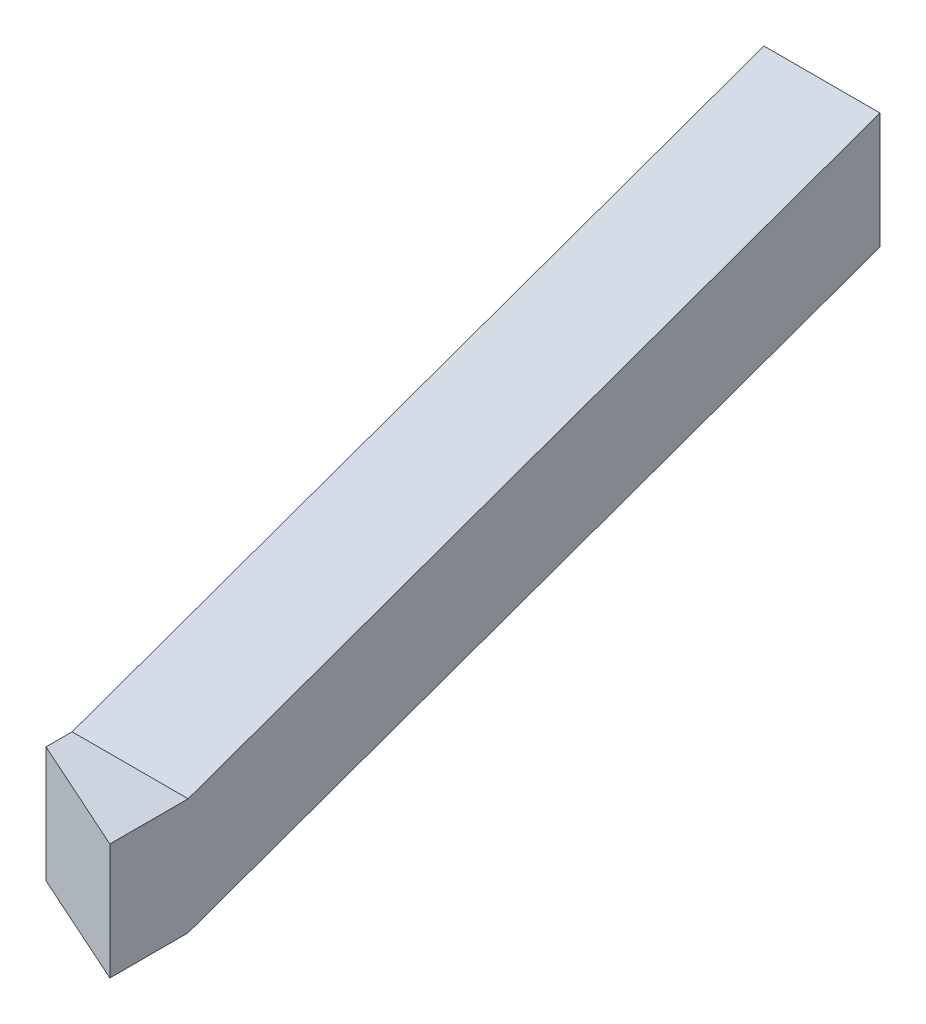
ISO-10303-21;
HEADER;
FILE_DESCRIPTION(('STEP AP214'),'2;1');
FILE_NAME('part.step','',(''),(''),'','','');
FILE_SCHEMA(('AUTOMOTIVE_DESIGN { 1 0 10303 214 1 1 1 1 }'));
ENDSEC;
DATA;
#1=APPLICATION_CONTEXT('core data for automotive mechanical design processes');
#2=APPLICATION_PROTOCOL_DEFINITION('international standard','automotive_design',2000,#1);
#3=PRODUCT_CONTEXT('',#1,'mechanical');
#4=PRODUCT('Part','Part','',(#3));
#5=PRODUCT_RELATED_PRODUCT_CATEGORY('part','',(#4));
#6=PRODUCT_DEFINITION_FORMATION('','',#4);
#7=PRODUCT_DEFINITION_CONTEXT('part definition',#1,'design');
#8=PRODUCT_DEFINITION('design','',#6,#7);
#9=PRODUCT_DEFINITION_SHAPE('','',#8);
#10=(LENGTH_UNIT() NAMED_UNIT(*) SI_UNIT(.MILLI.,.METRE.));
#11=(NAMED_UNIT(*) PLANE_ANGLE_UNIT() SI_UNIT($,.RADIAN.));
#12=(NAMED_UNIT(*) SI_UNIT($,.STERADIAN.) SOLID_ANGLE_UNIT());
#13=UNCERTAINTY_MEASURE_WITH_UNIT(LENGTH_MEASURE(1.E-05),#10,'distance_accuracy_value','');
#14=(GEOMETRIC_REPRESENTATION_CONTEXT(3) GLOBAL_UNCERTAINTY_ASSIGNED_CONTEXT((#13)) GLOBAL_UNIT_ASSIGNED_CONTEXT((#10,
#11,#12)) REPRESENTATION_CONTEXT('',''));
#15=CARTESIAN_POINT('',(0.,0.,0.));
#16=DIRECTION('',(0.,0.,1.));
#17=DIRECTION('',(1.,0.,0.));
#18=AXIS2_PLACEMENT_3D('',#15,#16,#17);
#19=CARTESIAN_POINT('',(0.,0.,-60.));
#20=DIRECTION('',(-1.,0.,0.));
#21=DIRECTION('',(0.,0.,1.));
#22=AXIS2_PLACEMENT_3D('',#19,#20,#21);
#23=PLANE('',#22);
#24=DIRECTION('',(0.,1.,0.));
#25=VECTOR('',#24,1.);
#26=CARTESIAN_POINT('',(0.,-11.1,-40.));
#27=LINE('',#26,#25);
#28=CARTESIAN_POINT('',(0.,0.,-40.));
#29=VERTEX_POINT('',#28);
#30=CARTESIAN_POINT('',(0.,88.9,-40.));
#31=VERTEX_POINT('',#30);
#32=EDGE_CURVE('E102',#29,#31,#27,.T.);
#33=ORIENTED_EDGE('',*,*,#32,.T.);
#34=DIRECTION('',(0.,0.,1.));
#35=VECTOR('',#34,1.);
#36=CARTESIAN_POINT('',(0.,88.9,-60.));
#37=LINE('',#36,#35);
#38=CARTESIAN_POINT('',(0.,88.9,-60.));
#39=VERTEX_POINT('',#38);
#40=EDGE_CURVE('E11',#39,#31,#37,.T.);
#41=ORIENTED_EDGE('',*,*,#40,.F.);
#42=DIRECTION('',(0.,-0.337461295829559,0.941339404156139));
#43=VECTOR('',#42,1.);
#44=CARTESIAN_POINT('',(0.,278.9,-590.));
#45=LINE('',#44,#43);
#46=CARTESIAN_POINT('',(0.,278.9,-590.));
#47=VERTEX_POINT('',#46);
#48=EDGE_CURVE('E95',#47,#39,#45,.T.);
#49=ORIENTED_EDGE('',*,*,#48,.F.);
#50=DIRECTION('',(0.,1.,0.));
#51=VECTOR('',#50,1.);
#52=CARTESIAN_POINT('',(0.,278.9,-590.));
#53=LINE('',#52,#51);
#54=CARTESIAN_POINT('',(0.,190.,-590.));
#55=VERTEX_POINT('',#54);
#56=EDGE_CURVE('E118',#55,#47,#53,.T.);
#57=ORIENTED_EDGE('',*,*,#56,.F.);
#58=DIRECTION('',(0.,-0.337461295829559,0.941339404156139));
#59=VECTOR('',#58,1.);
#60=CARTESIAN_POINT('',(0.,190.,-590.));
#61=LINE('',#60,#59);
#62=CARTESIAN_POINT('',(0.,0.,-60.));
#63=VERTEX_POINT('',#62);
#64=EDGE_CURVE('E120',#55,#63,#61,.T.);
#65=ORIENTED_EDGE('',*,*,#64,.T.);
#66=DIRECTION('',(0.,0.,1.));
#67=VECTOR('',#66,1.);
#68=CARTESIAN_POINT('',(0.,0.,-60.));
#69=LINE('',#68,#67);
#70=EDGE_CURVE('E38',#63,#29,#69,.T.);
#71=ORIENTED_EDGE('',*,*,#70,.T.);
#72=EDGE_LOOP('',(#33,#41,#49,#57,#65,#71));
#73=FACE_BOUND('',#72,.T.);
#74=ADVANCED_FACE('F35',(#73),#23,.T.);
#75=CARTESIAN_POINT('',(0.,88.9,-60.));
#76=DIRECTION('',(0.,1.,0.));
#77=DIRECTION('',(0.,0.,1.));
#78=AXIS2_PLACEMENT_3D('',#75,#76,#77);
#79=PLANE('',#78);
#80=DIRECTION('',(-0.911940698035273,0.,-0.41032202386289));
#81=VECTOR('',#80,1.);
#82=CARTESIAN_POINT('',(88.9,88.9,0.));
#83=LINE('',#82,#81);
#84=CARTESIAN_POINT('',(88.9,88.9,0.));
#85=VERTEX_POINT('',#84);
#86=EDGE_CURVE('E87',#85,#31,#83,.T.);
#87=ORIENTED_EDGE('',*,*,#86,.F.);
#88=DIRECTION('',(0.,0.,1.));
#89=VECTOR('',#88,1.);
#90=CARTESIAN_POINT('',(88.9,88.9,-60.));
#91=LINE('',#90,#89);
#92=CARTESIAN_POINT('',(88.9,88.9,-60.));
#93=VERTEX_POINT('',#92);
#94=EDGE_CURVE('E44',#93,#85,#91,.T.);
#95=ORIENTED_EDGE('',*,*,#94,.F.);
#96=DIRECTION('',(-1.,0.,0.));
#97=VECTOR('',#96,1.);
#98=CARTESIAN_POINT('',(0.,88.9,-60.));
#99=LINE('',#98,#97);
#100=EDGE_CURVE('E111',#93,#39,#99,.T.);
#101=ORIENTED_EDGE('',*,*,#100,.T.);
#102=ORIENTED_EDGE('',*,*,#40,.T.);
#103=EDGE_LOOP('',(#87,#95,#101,#102));
#104=FACE_BOUND('',#103,.T.);
#105=ADVANCED_FACE('F99',(#104),#79,.T.);
#106=CARTESIAN_POINT('',(88.9,0.,-60.));
#107=DIRECTION('',(1.,0.,0.));
#108=DIRECTION('',(0.,0.,-1.));
#109=AXIS2_PLACEMENT_3D('',#106,#107,#108);
#110=PLANE('',#109);
#111=DIRECTION('',(0.,1.,0.));
#112=VECTOR('',#111,1.);
#113=CARTESIAN_POINT('',(88.9,0.,0.));
#114=LINE('',#113,#112);
#115=CARTESIAN_POINT('',(88.9,0.,0.));
#116=VERTEX_POINT('',#115);
#117=EDGE_CURVE('E84',#116,#85,#114,.T.);
#118=ORIENTED_EDGE('',*,*,#117,.F.);
#119=DIRECTION('',(0.,0.,1.));
#120=VECTOR('',#119,1.);
#121=CARTESIAN_POINT('',(88.9,0.,-60.));
#122=LINE('',#121,#120);
#123=CARTESIAN_POINT('',(88.9,0.,-60.));
#124=VERTEX_POINT('',#123);
#125=EDGE_CURVE('E108',#124,#116,#122,.T.);
#126=ORIENTED_EDGE('',*,*,#125,.F.);
#127=DIRECTION('',(0.,-0.337461295829559,0.941339404156139));
#128=VECTOR('',#127,1.);
#129=CARTESIAN_POINT('',(88.9,190.,-590.));
#130=LINE('',#129,#128);
#131=CARTESIAN_POINT('',(88.9,190.,-590.));
#132=VERTEX_POINT('',#131);
#133=EDGE_CURVE('E51',#132,#124,#130,.T.);
#134=ORIENTED_EDGE('',*,*,#133,.F.);
#135=DIRECTION('',(0.,-1.,0.));
#136=VECTOR('',#135,1.);
#137=CARTESIAN_POINT('',(88.9,278.9,-590.));
#138=LINE('',#137,#136);
#139=CARTESIAN_POINT('',(88.9,278.9,-590.));
#140=VERTEX_POINT('',#139);
#141=EDGE_CURVE('E128',#140,#132,#138,.T.);
#142=ORIENTED_EDGE('',*,*,#141,.F.);
#143=DIRECTION('',(0.,-0.337461295829559,0.941339404156139));
#144=VECTOR('',#143,1.);
#145=CARTESIAN_POINT('',(88.9,278.9,-590.));
#146=LINE('',#145,#144);
#147=EDGE_CURVE('E107',#140,#93,#146,.T.);
#148=ORIENTED_EDGE('',*,*,#147,.T.);
#149=ORIENTED_EDGE('',*,*,#94,.T.);
#150=EDGE_LOOP('',(#118,#126,#134,#142,#148,#149));
#151=FACE_BOUND('',#150,.T.);
#152=ADVANCED_FACE('F105',(#151),#110,.T.);
#153=CARTESIAN_POINT('',(0.,0.,-60.));
#154=DIRECTION('',(0.,-1.,0.));
#155=DIRECTION('',(0.,0.,-1.));
#156=AXIS2_PLACEMENT_3D('',#153,#154,#155);
#157=PLANE('',#156);
#158=DIRECTION('',(0.911940698035273,0.,0.41032202386289));
#159=VECTOR('',#158,1.);
#160=CARTESIAN_POINT('',(-7.48378705721541,0.,-43.3672832653388));
#161=LINE('',#160,#159);
#162=EDGE_CURVE('E90',#29,#116,#161,.T.);
#163=ORIENTED_EDGE('',*,*,#162,.F.);
#164=ORIENTED_EDGE('',*,*,#70,.F.);
#165=DIRECTION('',(1.,0.,0.));
#166=VECTOR('',#165,1.);
#167=CARTESIAN_POINT('',(0.,0.,-60.));
#168=LINE('',#167,#166);
#169=EDGE_CURVE('E94',#63,#124,#168,.T.);
#170=ORIENTED_EDGE('',*,*,#169,.T.);
#171=ORIENTED_EDGE('',*,*,#125,.T.);
#172=EDGE_LOOP('',(#163,#164,#170,#171));
#173=FACE_BOUND('',#172,.T.);
#174=ADVANCED_FACE('F139',(#173),#157,.T.);
#175=CARTESIAN_POINT('',(0.,190.,-590.));
#176=DIRECTION('',(0.,0.,-1.));
#177=DIRECTION('',(-1.,0.,0.));
#178=AXIS2_PLACEMENT_3D('',#175,#176,#177);
#179=PLANE('',#178);
#180=ORIENTED_EDGE('',*,*,#141,.T.);
#181=DIRECTION('',(-1.,0.,0.));
#182=VECTOR('',#181,1.);
#183=CARTESIAN_POINT('',(88.9,190.,-590.));
#184=LINE('',#183,#182);
#185=EDGE_CURVE('E123',#132,#55,#184,.T.);
#186=ORIENTED_EDGE('',*,*,#185,.T.);
#187=ORIENTED_EDGE('',*,*,#56,.T.);
#188=DIRECTION('',(1.,0.,0.));
#189=VECTOR('',#188,1.);
#190=CARTESIAN_POINT('',(88.9,278.9,-590.));
#191=LINE('',#190,#189);
#192=EDGE_CURVE('E115',#47,#140,#191,.T.);
#193=ORIENTED_EDGE('',*,*,#192,.T.);
#194=EDGE_LOOP('',(#180,#186,#187,#193));
#195=FACE_BOUND('',#194,.T.);
#196=ADVANCED_FACE('F141',(#195),#179,.T.);
#197=CARTESIAN_POINT('',(88.9,190.,-590.));
#198=DIRECTION('',(0.,0.941339404156139,0.337461295829559));
#199=DIRECTION('',(0.,-0.337461295829559,0.941339404156139));
#200=AXIS2_PLACEMENT_3D('',#197,#198,#199);
#201=PLANE('',#200);
#202=ORIENTED_EDGE('',*,*,#64,.F.);
#203=ORIENTED_EDGE('',*,*,#185,.F.);
#204=ORIENTED_EDGE('',*,*,#133,.T.);
#205=ORIENTED_EDGE('',*,*,#169,.F.);
#206=EDGE_LOOP('',(#202,#203,#204,#205));
#207=FACE_BOUND('',#206,.T.);
#208=ADVANCED_FACE('F145',(#207),#201,.F.);
#209=CARTESIAN_POINT('',(88.9,278.9,-590.));
#210=DIRECTION('',(0.,-0.941339404156139,-0.337461295829559));
#211=DIRECTION('',(0.,0.337461295829559,-0.941339404156139));
#212=AXIS2_PLACEMENT_3D('',#209,#210,#211);
#213=PLANE('',#212);
#214=ORIENTED_EDGE('',*,*,#100,.F.);
#215=ORIENTED_EDGE('',*,*,#147,.F.);
#216=ORIENTED_EDGE('',*,*,#192,.F.);
#217=ORIENTED_EDGE('',*,*,#48,.T.);
#218=EDGE_LOOP('',(#214,#215,#216,#217));
#219=FACE_BOUND('',#218,.T.);
#220=ADVANCED_FACE('F143',(#219),#213,.F.);
#221=CARTESIAN_POINT('',(88.9,-11.1,0.));
#222=DIRECTION('',(0.41032202386289,0.,-0.911940698035273));
#223=DIRECTION('',(-0.911940698035273,0.,-0.41032202386289));
#224=AXIS2_PLACEMENT_3D('',#221,#222,#223);
#225=PLANE('',#224);
#226=ORIENTED_EDGE('',*,*,#162,.T.);
#227=ORIENTED_EDGE('',*,*,#117,.T.);
#228=ORIENTED_EDGE('',*,*,#86,.T.);
#229=ORIENTED_EDGE('',*,*,#32,.F.);
#230=EDGE_LOOP('',(#226,#227,#228,#229));
#231=FACE_BOUND('',#230,.T.);
#232=ADVANCED_FACE('F86',(#231),#225,.F.);
#233=CLOSED_SHELL('',(#74,#105,#152,#174,#196,#208,#220,#232));
#234=MANIFOLD_SOLID_BREP('B2',#233);
#235=ADVANCED_BREP_SHAPE_REPRESENTATION('',(#18,#234),#14);
#236=SHAPE_DEFINITION_REPRESENTATION(#9,#235);
ENDSEC;
END-ISO-10303-21;
